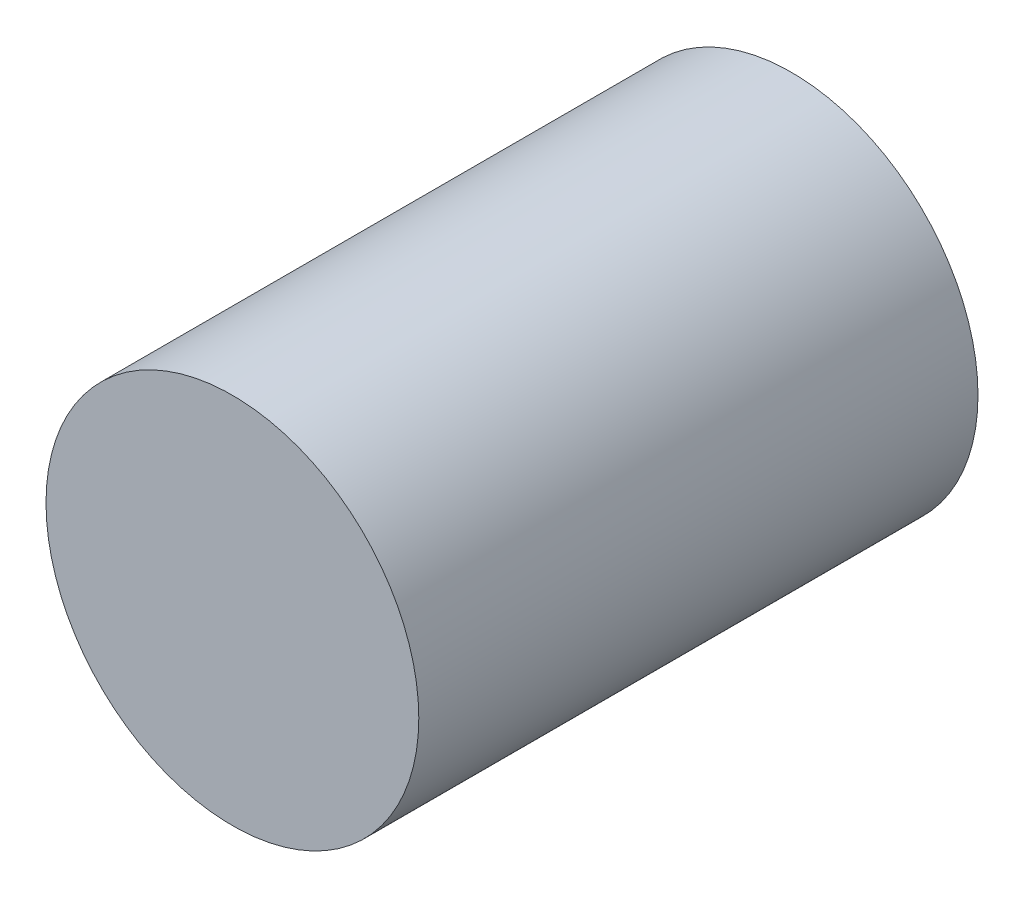
ISO-10303-21;
HEADER;
FILE_DESCRIPTION(('STEP AP214'),'2;1');
FILE_NAME('part.step','',(''),(''),'','','');
FILE_SCHEMA(('AUTOMOTIVE_DESIGN { 1 0 10303 214 1 1 1 1 }'));
ENDSEC;
DATA;
#1=APPLICATION_CONTEXT('core data for automotive mechanical design processes');
#2=APPLICATION_PROTOCOL_DEFINITION('international standard','automotive_design',2000,#1);
#3=PRODUCT_CONTEXT('',#1,'mechanical');
#4=PRODUCT('Part','Part','',(#3));
#5=PRODUCT_RELATED_PRODUCT_CATEGORY('part','',(#4));
#6=PRODUCT_DEFINITION_FORMATION('','',#4);
#7=PRODUCT_DEFINITION_CONTEXT('part definition',#1,'design');
#8=PRODUCT_DEFINITION('design','',#6,#7);
#9=PRODUCT_DEFINITION_SHAPE('','',#8);
#10=(LENGTH_UNIT() NAMED_UNIT(*) SI_UNIT(.MILLI.,.METRE.));
#11=(NAMED_UNIT(*) PLANE_ANGLE_UNIT() SI_UNIT($,.RADIAN.));
#12=(NAMED_UNIT(*) SI_UNIT($,.STERADIAN.) SOLID_ANGLE_UNIT());
#13=UNCERTAINTY_MEASURE_WITH_UNIT(LENGTH_MEASURE(1.E-05),#10,'distance_accuracy_value','');
#14=(GEOMETRIC_REPRESENTATION_CONTEXT(3) GLOBAL_UNCERTAINTY_ASSIGNED_CONTEXT((#13)) GLOBAL_UNIT_ASSIGNED_CONTEXT((#10,
#11,#12)) REPRESENTATION_CONTEXT('',''));
#15=CARTESIAN_POINT('',(0.,0.,0.));
#16=DIRECTION('',(0.,0.,1.));
#17=DIRECTION('',(1.,0.,0.));
#18=AXIS2_PLACEMENT_3D('',#15,#16,#17);
#19=CARTESIAN_POINT('',(0.,0.,457.2));
#20=DIRECTION('',(0.,0.,-1.));
#21=DIRECTION('',(-1.,0.,0.));
#22=AXIS2_PLACEMENT_3D('',#19,#20,#21);
#23=CYLINDRICAL_SURFACE('',#22,152.4);
#24=CARTESIAN_POINT('',(0.,0.,457.2));
#25=DIRECTION('',(0.,0.,1.));
#26=DIRECTION('',(1.,0.,0.));
#27=AXIS2_PLACEMENT_3D('',#24,#25,#26);
#28=CIRCLE('',#27,152.4);
#29=CARTESIAN_POINT('',(152.4,0.,457.2));
#30=VERTEX_POINT('',#29);
#31=EDGE_CURVE('E10',#30,#30,#28,.T.);
#32=ORIENTED_EDGE('',*,*,#31,.F.);
#33=EDGE_LOOP('',(#32));
#34=FACE_BOUND('',#33,.T.);
#35=CARTESIAN_POINT('',(0.,0.,0.));
#36=DIRECTION('',(0.,0.,1.));
#37=DIRECTION('',(1.,0.,0.));
#38=AXIS2_PLACEMENT_3D('',#35,#36,#37);
#39=CIRCLE('',#38,152.4);
#40=CARTESIAN_POINT('',(152.4,0.,0.));
#41=VERTEX_POINT('',#40);
#42=EDGE_CURVE('E46',#41,#41,#39,.T.);
#43=ORIENTED_EDGE('',*,*,#42,.T.);
#44=EDGE_LOOP('',(#43));
#45=FACE_BOUND('',#44,.T.);
#46=ADVANCED_FACE('F43',(#34,#45),#23,.T.);
#47=CARTESIAN_POINT('',(0.,0.,457.2));
#48=DIRECTION('',(0.,0.,1.));
#49=DIRECTION('',(1.,0.,0.));
#50=AXIS2_PLACEMENT_3D('',#47,#48,#49);
#51=PLANE('',#50);
#52=ORIENTED_EDGE('',*,*,#31,.T.);
#53=EDGE_LOOP('',(#52));
#54=FACE_BOUND('',#53,.T.);
#55=ADVANCED_FACE('F60',(#54),#51,.T.);
#56=CARTESIAN_POINT('',(0.,0.,0.));
#57=DIRECTION('',(0.,0.,1.));
#58=DIRECTION('',(1.,0.,0.));
#59=AXIS2_PLACEMENT_3D('',#56,#57,#58);
#60=PLANE('',#59);
#61=ORIENTED_EDGE('',*,*,#42,.F.);
#62=EDGE_LOOP('',(#61));
#63=FACE_BOUND('',#62,.T.);
#64=ADVANCED_FACE('F58',(#63),#60,.F.);
#65=CLOSED_SHELL('',(#46,#55,#64));
#66=MANIFOLD_SOLID_BREP('B2',#65);
#67=ADVANCED_BREP_SHAPE_REPRESENTATION('',(#18,#66),#14);
#68=SHAPE_DEFINITION_REPRESENTATION(#9,#67);
ENDSEC;
END-ISO-10303-21;
